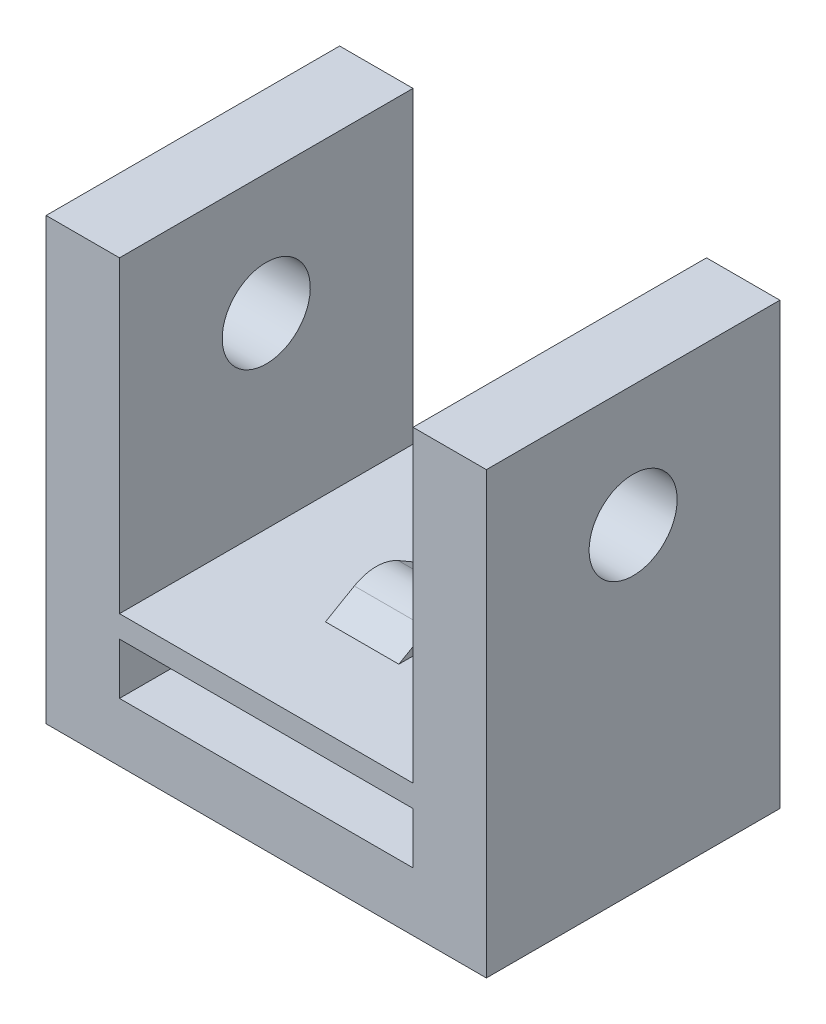
ISO-10303-21;
HEADER;
FILE_DESCRIPTION(('STEP AP214'),'2;1');
FILE_NAME('part.step','',(''),(''),'','','');
FILE_SCHEMA(('AUTOMOTIVE_DESIGN { 1 0 10303 214 1 1 1 1 }'));
ENDSEC;
DATA;
#1=APPLICATION_CONTEXT('core data for automotive mechanical design processes');
#2=APPLICATION_PROTOCOL_DEFINITION('international standard','automotive_design',2000,#1);
#3=PRODUCT_CONTEXT('',#1,'mechanical');
#4=PRODUCT('Part','Part','',(#3));
#5=PRODUCT_RELATED_PRODUCT_CATEGORY('part','',(#4));
#6=PRODUCT_DEFINITION_FORMATION('','',#4);
#7=PRODUCT_DEFINITION_CONTEXT('part definition',#1,'design');
#8=PRODUCT_DEFINITION('design','',#6,#7);
#9=PRODUCT_DEFINITION_SHAPE('','',#8);
#10=(LENGTH_UNIT() NAMED_UNIT(*) SI_UNIT(.MILLI.,.METRE.));
#11=(NAMED_UNIT(*) PLANE_ANGLE_UNIT() SI_UNIT($,.RADIAN.));
#12=(NAMED_UNIT(*) SI_UNIT($,.STERADIAN.) SOLID_ANGLE_UNIT());
#13=UNCERTAINTY_MEASURE_WITH_UNIT(LENGTH_MEASURE(1.E-05),#10,'distance_accuracy_value','');
#14=(GEOMETRIC_REPRESENTATION_CONTEXT(3) GLOBAL_UNCERTAINTY_ASSIGNED_CONTEXT((#13)) GLOBAL_UNIT_ASSIGNED_CONTEXT((#10,
#11,#12)) REPRESENTATION_CONTEXT('',''));
#15=CARTESIAN_POINT('',(0.,0.,0.));
#16=DIRECTION('',(0.,0.,1.));
#17=DIRECTION('',(1.,0.,0.));
#18=AXIS2_PLACEMENT_3D('',#15,#16,#17);
#19=CARTESIAN_POINT('',(-4.83125000000001,0.,10.));
#20=DIRECTION('',(1.,0.,0.));
#21=DIRECTION('',(0.,1.,0.));
#22=AXIS2_PLACEMENT_3D('',#19,#20,#21);
#23=PLANE('',#22);
#24=CARTESIAN_POINT('',(-4.83125000000001,2.73059676584087,5.));
#25=DIRECTION('',(1.,0.,0.));
#26=DIRECTION('',(0.,1.,0.));
#27=AXIS2_PLACEMENT_3D('',#24,#25,#26);
#28=CIRCLE('',#27,1.5);
#29=CARTESIAN_POINT('',(-4.83125000000001,4.23059676584087,5.));
#30=VERTEX_POINT('',#29);
#31=EDGE_CURVE('E196',#30,#30,#28,.T.);
#32=ORIENTED_EDGE('',*,*,#31,.F.);
#33=EDGE_LOOP('',(#32));
#34=FACE_BOUND('',#33,.T.);
#35=DIRECTION('',(0.,-1.,0.));
#36=VECTOR('',#35,1.);
#37=CARTESIAN_POINT('',(-4.83125000000001,0.,0.));
#38=LINE('',#37,#36);
#39=CARTESIAN_POINT('',(-4.83125,6.8625,0.));
#40=VERTEX_POINT('',#39);
#41=CARTESIAN_POINT('',(-4.83125,-3.6375,0.));
#42=VERTEX_POINT('',#41);
#43=EDGE_CURVE('E244',#40,#42,#38,.T.);
#44=ORIENTED_EDGE('',*,*,#43,.F.);
#45=DIRECTION('',(0.,0.,-1.));
#46=VECTOR('',#45,1.);
#47=CARTESIAN_POINT('',(-4.83125,6.8625,10.));
#48=LINE('',#47,#46);
#49=CARTESIAN_POINT('',(-4.83125,6.8625,10.));
#50=VERTEX_POINT('',#49);
#51=EDGE_CURVE('E298',#50,#40,#48,.T.);
#52=ORIENTED_EDGE('',*,*,#51,.F.);
#53=DIRECTION('',(0.,-1.,0.));
#54=VECTOR('',#53,1.);
#55=CARTESIAN_POINT('',(-4.83125000000001,0.,10.));
#56=LINE('',#55,#54);
#57=CARTESIAN_POINT('',(-4.83125,-3.6375,10.));
#58=VERTEX_POINT('',#57);
#59=EDGE_CURVE('E209',#50,#58,#56,.T.);
#60=ORIENTED_EDGE('',*,*,#59,.T.);
#61=DIRECTION('',(0.,0.,-1.));
#62=VECTOR('',#61,1.);
#63=CARTESIAN_POINT('',(-4.83125,-3.6375,10.));
#64=LINE('',#63,#62);
#65=EDGE_CURVE('E275',#58,#42,#64,.T.);
#66=ORIENTED_EDGE('',*,*,#65,.T.);
#67=EDGE_LOOP('',(#44,#52,#60,#66));
#68=FACE_BOUND('',#67,.T.);
#69=ADVANCED_FACE('F47',(#34,#68),#23,.T.);
#70=CARTESIAN_POINT('',(0.,6.8625,10.));
#71=DIRECTION('',(0.,1.,0.));
#72=DIRECTION('',(0.,0.,1.));
#73=AXIS2_PLACEMENT_3D('',#70,#71,#72);
#74=PLANE('',#73);
#75=DIRECTION('',(1.,0.,0.));
#76=VECTOR('',#75,1.);
#77=CARTESIAN_POINT('',(0.,6.8625,0.));
#78=LINE('',#77,#76);
#79=CARTESIAN_POINT('',(-7.33125,6.8625,0.));
#80=VERTEX_POINT('',#79);
#81=EDGE_CURVE('E255',#80,#40,#78,.T.);
#82=ORIENTED_EDGE('',*,*,#81,.F.);
#83=DIRECTION('',(0.,0.,-1.));
#84=VECTOR('',#83,1.);
#85=CARTESIAN_POINT('',(-7.33125,6.8625,10.));
#86=LINE('',#85,#84);
#87=CARTESIAN_POINT('',(-7.33125,6.8625,10.));
#88=VERTEX_POINT('',#87);
#89=EDGE_CURVE('E295',#88,#80,#86,.T.);
#90=ORIENTED_EDGE('',*,*,#89,.F.);
#91=DIRECTION('',(1.,0.,0.));
#92=VECTOR('',#91,1.);
#93=CARTESIAN_POINT('',(0.,6.8625,10.));
#94=LINE('',#93,#92);
#95=EDGE_CURVE('E219',#88,#50,#94,.T.);
#96=ORIENTED_EDGE('',*,*,#95,.T.);
#97=ORIENTED_EDGE('',*,*,#51,.T.);
#98=EDGE_LOOP('',(#82,#90,#96,#97));
#99=FACE_BOUND('',#98,.T.);
#100=ADVANCED_FACE('F364',(#99),#74,.T.);
#101=CARTESIAN_POINT('',(-7.33125,0.,10.));
#102=DIRECTION('',(1.,0.,0.));
#103=DIRECTION('',(0.,1.,0.));
#104=AXIS2_PLACEMENT_3D('',#101,#102,#103);
#105=PLANE('',#104);
#106=CARTESIAN_POINT('',(-7.33125,2.73059676584087,5.));
#107=DIRECTION('',(1.,0.,0.));
#108=DIRECTION('',(0.,1.,0.));
#109=AXIS2_PLACEMENT_3D('',#106,#107,#108);
#110=CIRCLE('',#109,1.5);
#111=CARTESIAN_POINT('',(-7.33125,4.23059676584087,5.));
#112=VERTEX_POINT('',#111);
#113=EDGE_CURVE('E433',#112,#112,#110,.T.);
#114=ORIENTED_EDGE('',*,*,#113,.T.);
#115=EDGE_LOOP('',(#114));
#116=FACE_BOUND('',#115,.T.);
#117=DIRECTION('',(0.,-1.,0.));
#118=VECTOR('',#117,1.);
#119=CARTESIAN_POINT('',(-7.33125,0.,0.));
#120=LINE('',#119,#118);
#121=CARTESIAN_POINT('',(-7.33125,-8.1375,0.));
#122=VERTEX_POINT('',#121);
#123=EDGE_CURVE('E259',#80,#122,#120,.T.);
#124=ORIENTED_EDGE('',*,*,#123,.T.);
#125=DIRECTION('',(0.,0.,-1.));
#126=VECTOR('',#125,1.);
#127=CARTESIAN_POINT('',(-7.33125,-8.1375,10.));
#128=LINE('',#127,#126);
#129=CARTESIAN_POINT('',(-7.33125,-8.1375,10.));
#130=VERTEX_POINT('',#129);
#131=EDGE_CURVE('E291',#130,#122,#128,.T.);
#132=ORIENTED_EDGE('',*,*,#131,.F.);
#133=DIRECTION('',(0.,-1.,0.));
#134=VECTOR('',#133,1.);
#135=CARTESIAN_POINT('',(-7.33125,0.,10.));
#136=LINE('',#135,#134);
#137=EDGE_CURVE('E223',#88,#130,#136,.T.);
#138=ORIENTED_EDGE('',*,*,#137,.F.);
#139=ORIENTED_EDGE('',*,*,#89,.T.);
#140=EDGE_LOOP('',(#124,#132,#138,#139));
#141=FACE_BOUND('',#140,.T.);
#142=ADVANCED_FACE('F361',(#116,#141),#105,.F.);
#143=CARTESIAN_POINT('',(0.,-8.1375,10.));
#144=DIRECTION('',(0.,1.,0.));
#145=DIRECTION('',(0.,0.,1.));
#146=AXIS2_PLACEMENT_3D('',#143,#144,#145);
#147=PLANE('',#146);
#148=DIRECTION('',(1.,0.,0.));
#149=VECTOR('',#148,1.);
#150=CARTESIAN_POINT('',(0.,-8.1375,0.));
#151=LINE('',#150,#149);
#152=CARTESIAN_POINT('',(7.66875,-8.1375,0.));
#153=VERTEX_POINT('',#152);
#154=EDGE_CURVE('E264',#122,#153,#151,.T.);
#155=ORIENTED_EDGE('',*,*,#154,.T.);
#156=DIRECTION('',(0.,0.,-1.));
#157=VECTOR('',#156,1.);
#158=CARTESIAN_POINT('',(7.66875,-8.1375,10.));
#159=LINE('',#158,#157);
#160=CARTESIAN_POINT('',(7.66875,-8.1375,10.));
#161=VERTEX_POINT('',#160);
#162=EDGE_CURVE('E288',#161,#153,#159,.T.);
#163=ORIENTED_EDGE('',*,*,#162,.F.);
#164=DIRECTION('',(1.,0.,0.));
#165=VECTOR('',#164,1.);
#166=CARTESIAN_POINT('',(0.,-8.1375,10.));
#167=LINE('',#166,#165);
#168=EDGE_CURVE('E228',#130,#161,#167,.T.);
#169=ORIENTED_EDGE('',*,*,#168,.F.);
#170=ORIENTED_EDGE('',*,*,#131,.T.);
#171=EDGE_LOOP('',(#155,#163,#169,#170));
#172=FACE_BOUND('',#171,.T.);
#173=ADVANCED_FACE('F358',(#172),#147,.F.);
#174=CARTESIAN_POINT('',(7.66875,0.,10.));
#175=DIRECTION('',(1.,0.,0.));
#176=DIRECTION('',(0.,1.,0.));
#177=AXIS2_PLACEMENT_3D('',#174,#175,#176);
#178=PLANE('',#177);
#179=CARTESIAN_POINT('',(7.66875,2.73059676584088,5.));
#180=DIRECTION('',(1.,0.,0.));
#181=DIRECTION('',(0.,1.,0.));
#182=AXIS2_PLACEMENT_3D('',#179,#180,#181);
#183=CIRCLE('',#182,1.5);
#184=CARTESIAN_POINT('',(7.66875,4.23059676584088,5.));
#185=VERTEX_POINT('',#184);
#186=EDGE_CURVE('E318',#185,#185,#183,.T.);
#187=ORIENTED_EDGE('',*,*,#186,.F.);
#188=EDGE_LOOP('',(#187));
#189=FACE_BOUND('',#188,.T.);
#190=DIRECTION('',(0.,-1.,0.));
#191=VECTOR('',#190,1.);
#192=CARTESIAN_POINT('',(7.66875,0.,0.));
#193=LINE('',#192,#191);
#194=CARTESIAN_POINT('',(7.66875,6.8625,0.));
#195=VERTEX_POINT('',#194);
#196=EDGE_CURVE('E268',#195,#153,#193,.T.);
#197=ORIENTED_EDGE('',*,*,#196,.F.);
#198=DIRECTION('',(0.,0.,-1.));
#199=VECTOR('',#198,1.);
#200=CARTESIAN_POINT('',(7.66875,6.8625,10.));
#201=LINE('',#200,#199);
#202=CARTESIAN_POINT('',(7.66875,6.8625,10.));
#203=VERTEX_POINT('',#202);
#204=EDGE_CURVE('E285',#203,#195,#201,.T.);
#205=ORIENTED_EDGE('',*,*,#204,.F.);
#206=DIRECTION('',(0.,-1.,0.));
#207=VECTOR('',#206,1.);
#208=CARTESIAN_POINT('',(7.66875,0.,10.));
#209=LINE('',#208,#207);
#210=EDGE_CURVE('E231',#203,#161,#209,.T.);
#211=ORIENTED_EDGE('',*,*,#210,.T.);
#212=ORIENTED_EDGE('',*,*,#162,.T.);
#213=EDGE_LOOP('',(#197,#205,#211,#212));
#214=FACE_BOUND('',#213,.T.);
#215=ADVANCED_FACE('F354',(#189,#214),#178,.T.);
#216=CARTESIAN_POINT('',(5.16875,6.8625,0.));
#217=VERTEX_POINT('',#216);
#218=EDGE_CURVE('E260',#217,#195,#78,.T.);
#219=ORIENTED_EDGE('',*,*,#218,.F.);
#220=DIRECTION('',(0.,0.,-1.));
#221=VECTOR('',#220,1.);
#222=CARTESIAN_POINT('',(5.16875,6.8625,10.));
#223=LINE('',#222,#221);
#224=CARTESIAN_POINT('',(5.16875,6.8625,10.));
#225=VERTEX_POINT('',#224);
#226=EDGE_CURVE('E282',#225,#217,#223,.T.);
#227=ORIENTED_EDGE('',*,*,#226,.F.);
#228=EDGE_CURVE('E224',#225,#203,#94,.T.);
#229=ORIENTED_EDGE('',*,*,#228,.T.);
#230=ORIENTED_EDGE('',*,*,#204,.T.);
#231=EDGE_LOOP('',(#219,#227,#229,#230));
#232=FACE_BOUND('',#231,.T.);
#233=ADVANCED_FACE('F349',(#232),#74,.T.);
#234=CARTESIAN_POINT('',(5.16875,0.,10.));
#235=DIRECTION('',(1.,0.,0.));
#236=DIRECTION('',(0.,1.,0.));
#237=AXIS2_PLACEMENT_3D('',#234,#235,#236);
#238=PLANE('',#237);
#239=CARTESIAN_POINT('',(5.16875,2.73059676584087,5.));
#240=DIRECTION('',(1.,0.,0.));
#241=DIRECTION('',(0.,1.,0.));
#242=AXIS2_PLACEMENT_3D('',#239,#240,#241);
#243=CIRCLE('',#242,1.5);
#244=CARTESIAN_POINT('',(5.16875,4.23059676584087,5.));
#245=VERTEX_POINT('',#244);
#246=EDGE_CURVE('E314',#245,#245,#243,.T.);
#247=ORIENTED_EDGE('',*,*,#246,.T.);
#248=EDGE_LOOP('',(#247));
#249=FACE_BOUND('',#248,.T.);
#250=DIRECTION('',(0.,-1.,0.));
#251=VECTOR('',#250,1.);
#252=CARTESIAN_POINT('',(5.16875,0.,0.));
#253=LINE('',#252,#251);
#254=CARTESIAN_POINT('',(5.16875,-3.6375,0.));
#255=VERTEX_POINT('',#254);
#256=EDGE_CURVE('E251',#217,#255,#253,.T.);
#257=ORIENTED_EDGE('',*,*,#256,.T.);
#258=DIRECTION('',(0.,0.,-1.));
#259=VECTOR('',#258,1.);
#260=CARTESIAN_POINT('',(5.16875,-3.6375,10.));
#261=LINE('',#260,#259);
#262=CARTESIAN_POINT('',(5.16875,-3.6375,10.));
#263=VERTEX_POINT('',#262);
#264=EDGE_CURVE('E278',#263,#255,#261,.T.);
#265=ORIENTED_EDGE('',*,*,#264,.F.);
#266=DIRECTION('',(0.,-1.,0.));
#267=VECTOR('',#266,1.);
#268=CARTESIAN_POINT('',(5.16875,0.,10.));
#269=LINE('',#268,#267);
#270=EDGE_CURVE('E216',#225,#263,#269,.T.);
#271=ORIENTED_EDGE('',*,*,#270,.F.);
#272=ORIENTED_EDGE('',*,*,#226,.T.);
#273=EDGE_LOOP('',(#257,#265,#271,#272));
#274=FACE_BOUND('',#273,.T.);
#275=ADVANCED_FACE('F346',(#249,#274),#238,.F.);
#276=CARTESIAN_POINT('',(-4.83125,-4.3875,0.));
#277=VERTEX_POINT('',#276);
#278=CARTESIAN_POINT('',(-4.83124999999999,-6.1375,0.));
#279=VERTEX_POINT('',#278);
#280=EDGE_CURVE('E171',#277,#279,#38,.T.);
#281=ORIENTED_EDGE('',*,*,#280,.F.);
#282=DIRECTION('',(0.,0.,-1.));
#283=VECTOR('',#282,1.);
#284=CARTESIAN_POINT('',(-4.83125,-4.3875,10.));
#285=LINE('',#284,#283);
#286=CARTESIAN_POINT('',(-4.83125,-4.3875,10.));
#287=VERTEX_POINT('',#286);
#288=EDGE_CURVE('E279',#287,#277,#285,.T.);
#289=ORIENTED_EDGE('',*,*,#288,.F.);
#290=CARTESIAN_POINT('',(-4.83124999999999,-6.1375,10.));
#291=VERTEX_POINT('',#290);
#292=EDGE_CURVE('E203',#287,#291,#56,.T.);
#293=ORIENTED_EDGE('',*,*,#292,.T.);
#294=DIRECTION('',(0.,0.,-1.));
#295=VECTOR('',#294,1.);
#296=CARTESIAN_POINT('',(-4.83124999999999,-6.1375,10.));
#297=LINE('',#296,#295);
#298=EDGE_CURVE('E239',#291,#279,#297,.T.);
#299=ORIENTED_EDGE('',*,*,#298,.T.);
#300=EDGE_LOOP('',(#281,#289,#293,#299));
#301=FACE_BOUND('',#300,.T.);
#302=ADVANCED_FACE('F385',(#301),#23,.T.);
#303=CARTESIAN_POINT('',(0.,-4.3875,10.));
#304=DIRECTION('',(0.,1.,0.));
#305=DIRECTION('',(-1.,0.,0.));
#306=AXIS2_PLACEMENT_3D('',#303,#304,#305);
#307=PLANE('',#306);
#308=DIRECTION('',(1.,0.,0.));
#309=VECTOR('',#308,1.);
#310=CARTESIAN_POINT('',(0.,-4.3875,0.));
#311=LINE('',#310,#309);
#312=CARTESIAN_POINT('',(5.16875,-4.3875,0.));
#313=VERTEX_POINT('',#312);
#314=EDGE_CURVE('E243',#277,#313,#311,.T.);
#315=ORIENTED_EDGE('',*,*,#314,.T.);
#316=DIRECTION('',(0.,0.,-1.));
#317=VECTOR('',#316,1.);
#318=CARTESIAN_POINT('',(5.16875,-4.3875,10.));
#319=LINE('',#318,#317);
#320=CARTESIAN_POINT('',(5.16875,-4.3875,10.));
#321=VERTEX_POINT('',#320);
#322=EDGE_CURVE('E308',#321,#313,#319,.T.);
#323=ORIENTED_EDGE('',*,*,#322,.F.);
#324=DIRECTION('',(1.,0.,0.));
#325=VECTOR('',#324,1.);
#326=CARTESIAN_POINT('',(0.,-4.3875,10.));
#327=LINE('',#326,#325);
#328=EDGE_CURVE('E207',#287,#321,#327,.T.);
#329=ORIENTED_EDGE('',*,*,#328,.F.);
#330=ORIENTED_EDGE('',*,*,#288,.T.);
#331=EDGE_LOOP('',(#315,#323,#329,#330));
#332=FACE_BOUND('',#331,.T.);
#333=ADVANCED_FACE('F395',(#332),#307,.F.);
#334=CARTESIAN_POINT('',(5.16875,-6.1375,0.));
#335=VERTEX_POINT('',#334);
#336=EDGE_CURVE('E247',#313,#335,#253,.T.);
#337=ORIENTED_EDGE('',*,*,#336,.T.);
#338=DIRECTION('',(0.,0.,-1.));
#339=VECTOR('',#338,1.);
#340=CARTESIAN_POINT('',(5.16875,-6.1375,10.));
#341=LINE('',#340,#339);
#342=CARTESIAN_POINT('',(5.16875,-6.1375,10.));
#343=VERTEX_POINT('',#342);
#344=EDGE_CURVE('E304',#343,#335,#341,.T.);
#345=ORIENTED_EDGE('',*,*,#344,.F.);
#346=EDGE_CURVE('E212',#321,#343,#269,.T.);
#347=ORIENTED_EDGE('',*,*,#346,.F.);
#348=ORIENTED_EDGE('',*,*,#322,.T.);
#349=EDGE_LOOP('',(#337,#345,#347,#348));
#350=FACE_BOUND('',#349,.T.);
#351=ADVANCED_FACE('F401',(#350),#238,.F.);
#352=CARTESIAN_POINT('',(0.,-6.1375,10.));
#353=DIRECTION('',(0.,-1.,0.));
#354=DIRECTION('',(1.,0.,0.));
#355=AXIS2_PLACEMENT_3D('',#352,#353,#354);
#356=PLANE('',#355);
#357=DIRECTION('',(-1.,0.,0.));
#358=VECTOR('',#357,1.);
#359=CARTESIAN_POINT('',(0.,-6.1375,0.));
#360=LINE('',#359,#358);
#361=EDGE_CURVE('E250',#335,#279,#360,.T.);
#362=ORIENTED_EDGE('',*,*,#361,.T.);
#363=ORIENTED_EDGE('',*,*,#298,.F.);
#364=DIRECTION('',(-1.,0.,0.));
#365=VECTOR('',#364,1.);
#366=CARTESIAN_POINT('',(0.,-6.1375,10.));
#367=LINE('',#366,#365);
#368=EDGE_CURVE('E215',#343,#291,#367,.T.);
#369=ORIENTED_EDGE('',*,*,#368,.F.);
#370=ORIENTED_EDGE('',*,*,#344,.T.);
#371=EDGE_LOOP('',(#362,#363,#369,#370));
#372=FACE_BOUND('',#371,.T.);
#373=ADVANCED_FACE('F378',(#372),#356,.F.);
#374=CARTESIAN_POINT('',(0.,-3.6375,10.));
#375=DIRECTION('',(0.,1.,0.));
#376=DIRECTION('',(-1.,0.,0.));
#377=AXIS2_PLACEMENT_3D('',#374,#375,#376);
#378=PLANE('',#377);
#379=DIRECTION('',(0.,0.,-1.));
#380=VECTOR('',#379,1.);
#381=CARTESIAN_POINT('',(1.41875,-3.6375,0.));
#382=LINE('',#381,#380);
#383=CARTESIAN_POINT('',(1.41875,-3.6375,6.73205080756887));
#384=VERTEX_POINT('',#383);
#385=CARTESIAN_POINT('',(1.41875,-3.6375,3.26794919243112));
#386=VERTEX_POINT('',#385);
#387=EDGE_CURVE('E177',#384,#386,#382,.T.);
#388=ORIENTED_EDGE('',*,*,#387,.F.);
#389=DIRECTION('',(-1.,0.,0.));
#390=VECTOR('',#389,1.);
#391=CARTESIAN_POINT('',(1.41875,-3.6375,6.73205080756887));
#392=LINE('',#391,#390);
#393=CARTESIAN_POINT('',(-1.08125,-3.6375,6.73205080756887));
#394=VERTEX_POINT('',#393);
#395=EDGE_CURVE('E160',#384,#394,#392,.T.);
#396=ORIENTED_EDGE('',*,*,#395,.T.);
#397=DIRECTION('',(0.,0.,-1.));
#398=VECTOR('',#397,1.);
#399=CARTESIAN_POINT('',(-1.08125,-3.6375,0.));
#400=LINE('',#399,#398);
#401=CARTESIAN_POINT('',(-1.08125,-3.6375,3.26794919243112));
#402=VERTEX_POINT('',#401);
#403=EDGE_CURVE('E195',#394,#402,#400,.T.);
#404=ORIENTED_EDGE('',*,*,#403,.T.);
#405=DIRECTION('',(-1.,0.,0.));
#406=VECTOR('',#405,1.);
#407=CARTESIAN_POINT('',(1.41875,-3.6375,3.26794919243112));
#408=LINE('',#407,#406);
#409=EDGE_CURVE('E172',#386,#402,#408,.T.);
#410=ORIENTED_EDGE('',*,*,#409,.F.);
#411=EDGE_LOOP('',(#388,#396,#404,#410));
#412=FACE_BOUND('',#411,.T.);
#413=DIRECTION('',(1.,0.,0.));
#414=VECTOR('',#413,1.);
#415=CARTESIAN_POINT('',(0.,-3.6375,0.));
#416=LINE('',#415,#414);
#417=EDGE_CURVE('E208',#42,#255,#416,.T.);
#418=ORIENTED_EDGE('',*,*,#417,.F.);
#419=ORIENTED_EDGE('',*,*,#65,.F.);
#420=DIRECTION('',(1.,0.,0.));
#421=VECTOR('',#420,1.);
#422=CARTESIAN_POINT('',(0.,-3.6375,10.));
#423=LINE('',#422,#421);
#424=EDGE_CURVE('E235',#58,#263,#423,.T.);
#425=ORIENTED_EDGE('',*,*,#424,.T.);
#426=ORIENTED_EDGE('',*,*,#264,.T.);
#427=EDGE_LOOP('',(#418,#419,#425,#426));
#428=FACE_BOUND('',#427,.T.);
#429=ADVANCED_FACE('F183',(#412,#428),#378,.T.);
#430=CARTESIAN_POINT('',(0.,0.,10.));
#431=DIRECTION('',(0.,0.,1.));
#432=DIRECTION('',(1.,0.,0.));
#433=AXIS2_PLACEMENT_3D('',#430,#431,#432);
#434=PLANE('',#433);
#435=ORIENTED_EDGE('',*,*,#292,.F.);
#436=ORIENTED_EDGE('',*,*,#328,.T.);
#437=ORIENTED_EDGE('',*,*,#346,.T.);
#438=ORIENTED_EDGE('',*,*,#368,.T.);
#439=EDGE_LOOP('',(#435,#436,#437,#438));
#440=FACE_BOUND('',#439,.T.);
#441=ORIENTED_EDGE('',*,*,#59,.F.);
#442=ORIENTED_EDGE('',*,*,#95,.F.);
#443=ORIENTED_EDGE('',*,*,#137,.T.);
#444=ORIENTED_EDGE('',*,*,#168,.T.);
#445=ORIENTED_EDGE('',*,*,#210,.F.);
#446=ORIENTED_EDGE('',*,*,#228,.F.);
#447=ORIENTED_EDGE('',*,*,#270,.T.);
#448=ORIENTED_EDGE('',*,*,#424,.F.);
#449=EDGE_LOOP('',(#441,#442,#443,#444,#445,#446,#447,#448));
#450=FACE_BOUND('',#449,.T.);
#451=ADVANCED_FACE('F367',(#440,#450),#434,.T.);
#452=CARTESIAN_POINT('',(0.,0.,0.));
#453=DIRECTION('',(0.,0.,1.));
#454=DIRECTION('',(1.,0.,0.));
#455=AXIS2_PLACEMENT_3D('',#452,#453,#454);
#456=PLANE('',#455);
#457=ORIENTED_EDGE('',*,*,#280,.T.);
#458=ORIENTED_EDGE('',*,*,#361,.F.);
#459=ORIENTED_EDGE('',*,*,#336,.F.);
#460=ORIENTED_EDGE('',*,*,#314,.F.);
#461=EDGE_LOOP('',(#457,#458,#459,#460));
#462=FACE_BOUND('',#461,.T.);
#463=ORIENTED_EDGE('',*,*,#43,.T.);
#464=ORIENTED_EDGE('',*,*,#417,.T.);
#465=ORIENTED_EDGE('',*,*,#256,.F.);
#466=ORIENTED_EDGE('',*,*,#218,.T.);
#467=ORIENTED_EDGE('',*,*,#196,.T.);
#468=ORIENTED_EDGE('',*,*,#154,.F.);
#469=ORIENTED_EDGE('',*,*,#123,.F.);
#470=ORIENTED_EDGE('',*,*,#81,.T.);
#471=EDGE_LOOP('',(#463,#464,#465,#466,#467,#468,#469,#470));
#472=FACE_BOUND('',#471,.T.);
#473=ADVANCED_FACE('F337',(#462,#472),#456,.F.);
#474=CARTESIAN_POINT('',(1.41875,0.186938509461101,0.107928998759274));
#475=DIRECTION('',(0.,0.866025403784438,0.5));
#476=DIRECTION('',(0.,-0.5,0.866025403784438));
#477=AXIS2_PLACEMENT_3D('',#474,#475,#476);
#478=PLANE('',#477);
#479=DIRECTION('',(0.,0.5,-0.866025403784439));
#480=VECTOR('',#479,1.);
#481=CARTESIAN_POINT('',(1.41875,0.186938509461101,0.107928998759274));
#482=LINE('',#481,#480);
#483=CARTESIAN_POINT('',(1.41875,-3.07051270189222,5.75));
#484=VERTEX_POINT('',#483);
#485=EDGE_CURVE('E164',#384,#484,#482,.T.);
#486=ORIENTED_EDGE('',*,*,#485,.T.);
#487=DIRECTION('',(-1.,0.,0.));
#488=VECTOR('',#487,1.);
#489=CARTESIAN_POINT('',(1.41875,-3.07051270189222,5.75));
#490=LINE('',#489,#488);
#491=CARTESIAN_POINT('',(-1.08125,-3.07051270189222,5.75));
#492=VERTEX_POINT('',#491);
#493=EDGE_CURVE('E301',#484,#492,#490,.T.);
#494=ORIENTED_EDGE('',*,*,#493,.T.);
#495=DIRECTION('',(0.,0.5,-0.866025403784439));
#496=VECTOR('',#495,1.);
#497=CARTESIAN_POINT('',(-1.08125,0.1869385094611,0.107928998759274));
#498=LINE('',#497,#496);
#499=EDGE_CURVE('E166',#394,#492,#498,.T.);
#500=ORIENTED_EDGE('',*,*,#499,.F.);
#501=ORIENTED_EDGE('',*,*,#395,.F.);
#502=EDGE_LOOP('',(#486,#494,#500,#501));
#503=FACE_BOUND('',#502,.T.);
#504=ADVANCED_FACE('F162',(#503),#478,.T.);
#505=CARTESIAN_POINT('',(1.41875,-4.14318850946109,2.39207100124073));
#506=DIRECTION('',(0.,0.866025403784438,-0.5));
#507=DIRECTION('',(0.,0.5,0.866025403784438));
#508=AXIS2_PLACEMENT_3D('',#505,#506,#507);
#509=PLANE('',#508);
#510=DIRECTION('',(0.,-0.5,-0.866025403784439));
#511=VECTOR('',#510,1.);
#512=CARTESIAN_POINT('',(-1.08125,-4.14318850946109,2.39207100124073));
#513=LINE('',#512,#511);
#514=CARTESIAN_POINT('',(-1.08125,-3.07051270189222,4.25));
#515=VERTEX_POINT('',#514);
#516=EDGE_CURVE('E181',#515,#402,#513,.T.);
#517=ORIENTED_EDGE('',*,*,#516,.F.);
#518=DIRECTION('',(-1.,0.,0.));
#519=VECTOR('',#518,1.);
#520=CARTESIAN_POINT('',(1.41875,-3.07051270189222,4.25));
#521=LINE('',#520,#519);
#522=CARTESIAN_POINT('',(1.41875,-3.07051270189222,4.25));
#523=VERTEX_POINT('',#522);
#524=EDGE_CURVE('E56',#515,#523,#521,.F.);
#525=ORIENTED_EDGE('',*,*,#524,.T.);
#526=DIRECTION('',(0.,-0.5,-0.866025403784439));
#527=VECTOR('',#526,1.);
#528=CARTESIAN_POINT('',(1.41875,-4.14318850946109,2.39207100124073));
#529=LINE('',#528,#527);
#530=EDGE_CURVE('E187',#523,#386,#529,.T.);
#531=ORIENTED_EDGE('',*,*,#530,.T.);
#532=ORIENTED_EDGE('',*,*,#409,.T.);
#533=EDGE_LOOP('',(#517,#525,#531,#532));
#534=FACE_BOUND('',#533,.T.);
#535=ADVANCED_FACE('F459',(#534),#509,.T.);
#536=CARTESIAN_POINT('',(1.41875,0.,0.));
#537=DIRECTION('',(1.,0.,0.));
#538=DIRECTION('',(0.,1.,0.));
#539=AXIS2_PLACEMENT_3D('',#536,#537,#538);
#540=PLANE('',#539);
#541=ORIENTED_EDGE('',*,*,#530,.F.);
#542=CARTESIAN_POINT('',(1.41875,-4.36955080756887,5.));
#543=DIRECTION('',(1.,0.,0.));
#544=DIRECTION('',(0.,1.,0.));
#545=AXIS2_PLACEMENT_3D('',#542,#543,#544);
#546=CIRCLE('',#545,1.5);
#547=EDGE_CURVE('E11',#523,#484,#546,.T.);
#548=ORIENTED_EDGE('',*,*,#547,.T.);
#549=ORIENTED_EDGE('',*,*,#485,.F.);
#550=ORIENTED_EDGE('',*,*,#387,.T.);
#551=EDGE_LOOP('',(#541,#548,#549,#550));
#552=FACE_BOUND('',#551,.T.);
#553=ADVANCED_FACE('F176',(#552),#540,.T.);
#554=CARTESIAN_POINT('',(-1.08125,0.,0.));
#555=DIRECTION('',(1.,0.,0.));
#556=DIRECTION('',(0.,1.,0.));
#557=AXIS2_PLACEMENT_3D('',#554,#555,#556);
#558=PLANE('',#557);
#559=ORIENTED_EDGE('',*,*,#499,.T.);
#560=CARTESIAN_POINT('',(-1.08125,-4.36955080756887,5.));
#561=DIRECTION('',(1.,0.,0.));
#562=DIRECTION('',(0.,1.,0.));
#563=AXIS2_PLACEMENT_3D('',#560,#561,#562);
#564=CIRCLE('',#563,1.5);
#565=EDGE_CURVE('E70',#492,#515,#564,.F.);
#566=ORIENTED_EDGE('',*,*,#565,.T.);
#567=ORIENTED_EDGE('',*,*,#516,.T.);
#568=ORIENTED_EDGE('',*,*,#403,.F.);
#569=EDGE_LOOP('',(#559,#566,#567,#568));
#570=FACE_BOUND('',#569,.T.);
#571=ADVANCED_FACE('F448',(#570),#558,.F.);
#572=CARTESIAN_POINT('',(-24.83125,2.73059676584087,5.));
#573=DIRECTION('',(1.,0.,0.));
#574=DIRECTION('',(0.,1.,0.));
#575=AXIS2_PLACEMENT_3D('',#572,#573,#574);
#576=CYLINDRICAL_SURFACE('',#575,1.5);
#577=ORIENTED_EDGE('',*,*,#186,.T.);
#578=EDGE_LOOP('',(#577));
#579=FACE_BOUND('',#578,.T.);
#580=ORIENTED_EDGE('',*,*,#246,.F.);
#581=EDGE_LOOP('',(#580));
#582=FACE_BOUND('',#581,.T.);
#583=ADVANCED_FACE('F444',(#579,#582),#576,.F.);
#584=ORIENTED_EDGE('',*,*,#31,.T.);
#585=EDGE_LOOP('',(#584));
#586=FACE_BOUND('',#585,.T.);
#587=ORIENTED_EDGE('',*,*,#113,.F.);
#588=EDGE_LOOP('',(#587));
#589=FACE_BOUND('',#588,.T.);
#590=ADVANCED_FACE('F447',(#586,#589),#576,.F.);
#591=CARTESIAN_POINT('',(1.41875,-4.36955080756887,5.));
#592=DIRECTION('',(-1.,0.,0.));
#593=DIRECTION('',(0.,-1.,0.));
#594=AXIS2_PLACEMENT_3D('',#591,#592,#593);
#595=CYLINDRICAL_SURFACE('',#594,1.5);
#596=ORIENTED_EDGE('',*,*,#547,.F.);
#597=ORIENTED_EDGE('',*,*,#524,.F.);
#598=ORIENTED_EDGE('',*,*,#565,.F.);
#599=ORIENTED_EDGE('',*,*,#493,.F.);
#600=EDGE_LOOP('',(#596,#597,#598,#599));
#601=FACE_BOUND('',#600,.T.);
#602=ADVANCED_FACE('F49',(#601),#595,.T.);
#603=CLOSED_SHELL('',(#69,#100,#142,#173,#215,#233,#275,#302,#333,#351,#373,#429,#451,#473,#504,
#535,#553,#571,#583,#590,#602));
#604=MANIFOLD_SOLID_BREP('B2',#603);
#605=ADVANCED_BREP_SHAPE_REPRESENTATION('',(#18,#604),#14);
#606=SHAPE_DEFINITION_REPRESENTATION(#9,#605);
ENDSEC;
END-ISO-10303-21;
